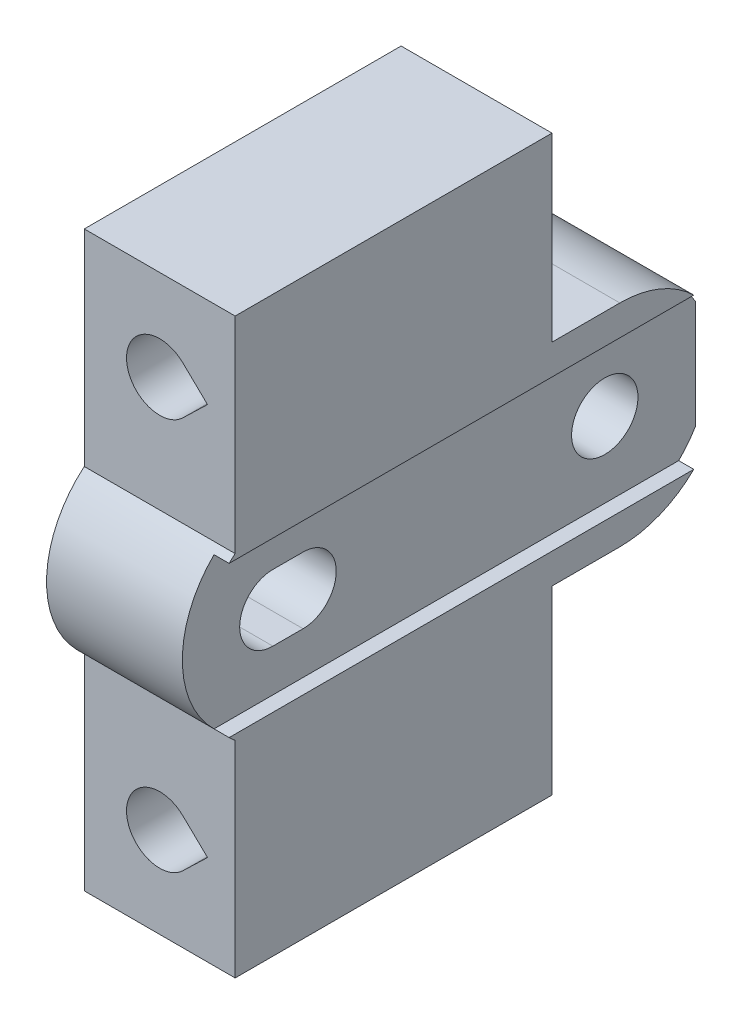
ISO-10303-21;
HEADER;
FILE_DESCRIPTION(('STEP AP214'),'2;1');
FILE_NAME('part.step','',(''),(''),'','','');
FILE_SCHEMA(('AUTOMOTIVE_DESIGN { 1 0 10303 214 1 1 1 1 }'));
ENDSEC;
DATA;
#1=APPLICATION_CONTEXT('core data for automotive mechanical design processes');
#2=APPLICATION_PROTOCOL_DEFINITION('international standard','automotive_design',2000,#1);
#3=PRODUCT_CONTEXT('',#1,'mechanical');
#4=PRODUCT('Part','Part','',(#3));
#5=PRODUCT_RELATED_PRODUCT_CATEGORY('part','',(#4));
#6=PRODUCT_DEFINITION_FORMATION('','',#4);
#7=PRODUCT_DEFINITION_CONTEXT('part definition',#1,'design');
#8=PRODUCT_DEFINITION('design','',#6,#7);
#9=PRODUCT_DEFINITION_SHAPE('','',#8);
#10=(LENGTH_UNIT() NAMED_UNIT(*) SI_UNIT(.MILLI.,.METRE.));
#11=(NAMED_UNIT(*) PLANE_ANGLE_UNIT() SI_UNIT($,.RADIAN.));
#12=(NAMED_UNIT(*) SI_UNIT($,.STERADIAN.) SOLID_ANGLE_UNIT());
#13=UNCERTAINTY_MEASURE_WITH_UNIT(LENGTH_MEASURE(1.E-05),#10,'distance_accuracy_value','');
#14=(GEOMETRIC_REPRESENTATION_CONTEXT(3) GLOBAL_UNCERTAINTY_ASSIGNED_CONTEXT((#13)) GLOBAL_UNIT_ASSIGNED_CONTEXT((#10,
#11,#12)) REPRESENTATION_CONTEXT('',''));
#15=CARTESIAN_POINT('',(0.,0.,0.));
#16=DIRECTION('',(0.,0.,1.));
#17=DIRECTION('',(1.,0.,0.));
#18=AXIS2_PLACEMENT_3D('',#15,#16,#17);
#19=CARTESIAN_POINT('',(13.9,6.99999999999998,14.9999999999964));
#20=DIRECTION('',(0.,1.,0.));
#21=DIRECTION('',(-1.,0.,0.));
#22=AXIS2_PLACEMENT_3D('',#19,#20,#21);
#23=PLANE('',#22);
#24=DIRECTION('',(0.,0.,-1.));
#25=VECTOR('',#24,1.);
#26=CARTESIAN_POINT('',(4.90000000000001,6.99999999999999,14.9999999999964));
#27=LINE('',#26,#25);
#28=CARTESIAN_POINT('',(4.90000000000001,6.99999999999999,-6.));
#29=VERTEX_POINT('',#28);
#30=CARTESIAN_POINT('',(4.90000000000001,6.99999999999999,-10.5));
#31=VERTEX_POINT('',#30);
#32=EDGE_CURVE('E392',#29,#31,#27,.T.);
#33=ORIENTED_EDGE('',*,*,#32,.F.);
#34=DIRECTION('',(-1.,0.,0.));
#35=VECTOR('',#34,1.);
#36=CARTESIAN_POINT('',(4.90000000000001,6.99999999999999,-6.));
#37=LINE('',#36,#35);
#38=CARTESIAN_POINT('',(14.9,6.99999999999998,-6.));
#39=VERTEX_POINT('',#38);
#40=EDGE_CURVE('E285',#39,#29,#37,.T.);
#41=ORIENTED_EDGE('',*,*,#40,.F.);
#42=DIRECTION('',(0.,0.,1.));
#43=VECTOR('',#42,1.);
#44=CARTESIAN_POINT('',(14.9,6.99999999999999,14.9999999999964));
#45=LINE('',#44,#43);
#46=CARTESIAN_POINT('',(14.9,6.99999999999999,-10.5));
#47=VERTEX_POINT('',#46);
#48=EDGE_CURVE('E331',#47,#39,#45,.T.);
#49=ORIENTED_EDGE('',*,*,#48,.F.);
#50=DIRECTION('',(-1.,0.,0.));
#51=VECTOR('',#50,1.);
#52=CARTESIAN_POINT('',(13.9,6.99999999999998,-10.5));
#53=LINE('',#52,#51);
#54=EDGE_CURVE('E401',#47,#31,#53,.T.);
#55=ORIENTED_EDGE('',*,*,#54,.T.);
#56=EDGE_LOOP('',(#33,#41,#49,#55));
#57=FACE_BOUND('',#56,.T.);
#58=ADVANCED_FACE('F30',(#57),#23,.T.);
#59=CARTESIAN_POINT('',(13.9,-6.99999999999999,-10.5));
#60=DIRECTION('',(0.,-1.,0.));
#61=DIRECTION('',(1.,0.,0.));
#62=AXIS2_PLACEMENT_3D('',#59,#60,#61);
#63=PLANE('',#62);
#64=DIRECTION('',(0.,0.,-1.));
#65=VECTOR('',#64,1.);
#66=CARTESIAN_POINT('',(14.9,-6.99999999999999,-10.5));
#67=LINE('',#66,#65);
#68=CARTESIAN_POINT('',(14.9,-6.99999999999999,-5.99999999999999));
#69=VERTEX_POINT('',#68);
#70=CARTESIAN_POINT('',(14.9,-6.99999999999999,-10.5));
#71=VERTEX_POINT('',#70);
#72=EDGE_CURVE('E341',#69,#71,#67,.T.);
#73=ORIENTED_EDGE('',*,*,#72,.F.);
#74=DIRECTION('',(1.,0.,0.));
#75=VECTOR('',#74,1.);
#76=CARTESIAN_POINT('',(14.9,-6.99999999999999,-6.));
#77=LINE('',#76,#75);
#78=CARTESIAN_POINT('',(4.90000000000001,-6.99999999999999,-6.));
#79=VERTEX_POINT('',#78);
#80=EDGE_CURVE('E303',#79,#69,#77,.T.);
#81=ORIENTED_EDGE('',*,*,#80,.F.);
#82=DIRECTION('',(0.,0.,1.));
#83=VECTOR('',#82,1.);
#84=CARTESIAN_POINT('',(4.90000000000001,-6.99999999999999,-10.5));
#85=LINE('',#84,#83);
#86=CARTESIAN_POINT('',(4.90000000000001,-6.99999999999999,-10.5));
#87=VERTEX_POINT('',#86);
#88=EDGE_CURVE('E373',#87,#79,#85,.T.);
#89=ORIENTED_EDGE('',*,*,#88,.F.);
#90=DIRECTION('',(-1.,0.,0.));
#91=VECTOR('',#90,1.);
#92=CARTESIAN_POINT('',(13.9,-6.99999999999999,-10.5));
#93=LINE('',#92,#91);
#94=EDGE_CURVE('E408',#71,#87,#93,.T.);
#95=ORIENTED_EDGE('',*,*,#94,.F.);
#96=EDGE_LOOP('',(#73,#81,#89,#95));
#97=FACE_BOUND('',#96,.T.);
#98=ADVANCED_FACE('F451',(#97),#63,.T.);
#99=CARTESIAN_POINT('',(13.9,0.,-10.5));
#100=DIRECTION('',(-1.,0.,0.));
#101=DIRECTION('',(0.,-1.,0.));
#102=AXIS2_PLACEMENT_3D('',#99,#100,#101);
#103=PLANE('',#102);
#104=CARTESIAN_POINT('',(13.9,0.,-10.5));
#105=DIRECTION('',(1.,0.,0.));
#106=DIRECTION('',(0.,0.,-1.));
#107=AXIS2_PLACEMENT_3D('',#104,#105,#106);
#108=CIRCLE('',#107,2.20000000000001);
#109=CARTESIAN_POINT('',(13.9,0.,-12.7));
#110=VERTEX_POINT('',#109);
#111=EDGE_CURVE('E717',#110,#110,#108,.T.);
#112=ORIENTED_EDGE('',*,*,#111,.F.);
#113=EDGE_LOOP('',(#112));
#114=FACE_BOUND('',#113,.T.);
#115=DIRECTION('',(0.,0.,-1.));
#116=VECTOR('',#115,1.);
#117=CARTESIAN_POINT('',(13.9,2.20000000000001,-10.5));
#118=LINE('',#117,#116);
#119=CARTESIAN_POINT('',(13.9,2.20000000000001,11.5));
#120=VERTEX_POINT('',#119);
#121=CARTESIAN_POINT('',(13.9,2.20000000000001,9.5));
#122=VERTEX_POINT('',#121);
#123=EDGE_CURVE('E257',#120,#122,#118,.T.);
#124=ORIENTED_EDGE('',*,*,#123,.T.);
#125=CARTESIAN_POINT('',(13.9,0.,9.5));
#126=DIRECTION('',(-1.,0.,0.));
#127=DIRECTION('',(0.,-1.,0.));
#128=AXIS2_PLACEMENT_3D('',#125,#126,#127);
#129=CIRCLE('',#128,2.2);
#130=CARTESIAN_POINT('',(13.9,-2.19999999999999,9.5));
#131=VERTEX_POINT('',#130);
#132=EDGE_CURVE('E260',#122,#131,#129,.T.);
#133=ORIENTED_EDGE('',*,*,#132,.T.);
#134=DIRECTION('',(0.,0.,1.));
#135=VECTOR('',#134,1.);
#136=CARTESIAN_POINT('',(13.9,-2.19999999999999,-10.5));
#137=LINE('',#136,#135);
#138=CARTESIAN_POINT('',(13.9,-2.19999999999999,11.5));
#139=VERTEX_POINT('',#138);
#140=EDGE_CURVE('E245',#131,#139,#137,.T.);
#141=ORIENTED_EDGE('',*,*,#140,.T.);
#142=CARTESIAN_POINT('',(13.9,0.,11.5));
#143=DIRECTION('',(-1.,0.,0.));
#144=DIRECTION('',(0.,-1.,0.));
#145=AXIS2_PLACEMENT_3D('',#142,#143,#144);
#146=CIRCLE('',#145,2.2);
#147=EDGE_CURVE('E254',#139,#120,#146,.T.);
#148=ORIENTED_EDGE('',*,*,#147,.T.);
#149=EDGE_LOOP('',(#124,#133,#141,#148));
#150=FACE_BOUND('',#149,.T.);
#151=DIRECTION('',(0.,0.,-1.));
#152=VECTOR('',#151,1.);
#153=CARTESIAN_POINT('',(13.9,5.00001329836298,-15.3989659129446));
#154=LINE('',#153,#152);
#155=CARTESIAN_POINT('',(13.9,5.00001329836298,15.3989659129446));
#156=VERTEX_POINT('',#155);
#157=CARTESIAN_POINT('',(13.9,5.00001329836297,-15.3989659129446));
#158=VERTEX_POINT('',#157);
#159=EDGE_CURVE('E320',#156,#158,#154,.T.);
#160=ORIENTED_EDGE('',*,*,#159,.F.);
#161=CARTESIAN_POINT('',(13.9,0.,10.5));
#162=DIRECTION('',(-1.,0.,0.));
#163=DIRECTION('',(0.,-1.,0.));
#164=AXIS2_PLACEMENT_3D('',#161,#162,#163);
#165=CIRCLE('',#164,6.99999999999999);
#166=CARTESIAN_POINT('',(13.9,-4.99998670163702,15.3989930581144));
#167=VERTEX_POINT('',#166);
#168=EDGE_CURVE('E361',#167,#156,#165,.T.);
#169=ORIENTED_EDGE('',*,*,#168,.F.);
#170=DIRECTION('',(0.,0.,1.));
#171=VECTOR('',#170,1.);
#172=CARTESIAN_POINT('',(13.9,-4.99998670163702,15.3989930581144));
#173=LINE('',#172,#171);
#174=CARTESIAN_POINT('',(13.9,-4.99998670163702,-15.3989930581144));
#175=VERTEX_POINT('',#174);
#176=EDGE_CURVE('E340',#175,#167,#173,.T.);
#177=ORIENTED_EDGE('',*,*,#176,.F.);
#178=CARTESIAN_POINT('',(13.9,0.,-10.5));
#179=DIRECTION('',(-1.,0.,0.));
#180=DIRECTION('',(0.,-1.,0.));
#181=AXIS2_PLACEMENT_3D('',#178,#179,#180);
#182=CIRCLE('',#181,6.99999999999999);
#183=CARTESIAN_POINT('',(13.9,-3.60555127546401,-16.5));
#184=VERTEX_POINT('',#183);
#185=EDGE_CURVE('E398',#184,#175,#182,.T.);
#186=ORIENTED_EDGE('',*,*,#185,.F.);
#187=DIRECTION('',(0.,-1.,0.));
#188=VECTOR('',#187,1.);
#189=CARTESIAN_POINT('',(13.9,3.60555127546398,-16.5));
#190=LINE('',#189,#188);
#191=CARTESIAN_POINT('',(13.9,3.60555127546398,-16.5));
#192=VERTEX_POINT('',#191);
#193=EDGE_CURVE('E382',#192,#184,#190,.T.);
#194=ORIENTED_EDGE('',*,*,#193,.F.);
#195=CARTESIAN_POINT('',(13.9,0.,-10.5));
#196=DIRECTION('',(-1.,0.,0.));
#197=DIRECTION('',(0.,-1.,0.));
#198=AXIS2_PLACEMENT_3D('',#195,#196,#197);
#199=CIRCLE('',#198,7.);
#200=EDGE_CURVE('E413',#158,#192,#199,.T.);
#201=ORIENTED_EDGE('',*,*,#200,.F.);
#202=EDGE_LOOP('',(#160,#169,#177,#186,#194,#201));
#203=FACE_BOUND('',#202,.T.);
#204=ADVANCED_FACE('F427',(#114,#150,#203),#103,.F.);
#205=CARTESIAN_POINT('',(13.9,0.,-10.5));
#206=DIRECTION('',(-1.,0.,0.));
#207=DIRECTION('',(0.,-1.,0.));
#208=AXIS2_PLACEMENT_3D('',#205,#206,#207);
#209=CYLINDRICAL_SURFACE('',#208,6.99999999999999);
#210=CARTESIAN_POINT('',(4.90000000000001,0.,-10.5));
#211=DIRECTION('',(-1.,0.,0.));
#212=DIRECTION('',(0.,-1.,0.));
#213=AXIS2_PLACEMENT_3D('',#210,#211,#212);
#214=CIRCLE('',#213,6.99999999999999);
#215=CARTESIAN_POINT('',(4.90000000000001,-3.60555127546401,-16.5));
#216=VERTEX_POINT('',#215);
#217=EDGE_CURVE('E368',#216,#87,#214,.T.);
#218=ORIENTED_EDGE('',*,*,#217,.F.);
#219=DIRECTION('',(-1.,0.,0.));
#220=VECTOR('',#219,1.);
#221=CARTESIAN_POINT('',(13.9,-3.60555127546401,-16.5));
#222=LINE('',#221,#220);
#223=EDGE_CURVE('E11',#184,#216,#222,.T.);
#224=ORIENTED_EDGE('',*,*,#223,.F.);
#225=ORIENTED_EDGE('',*,*,#185,.T.);
#226=DIRECTION('',(-1.,0.,0.));
#227=VECTOR('',#226,1.);
#228=CARTESIAN_POINT('',(14.9,-4.99998670163702,-15.3989930581144));
#229=LINE('',#228,#227);
#230=CARTESIAN_POINT('',(14.9,-4.99998670163702,-15.3989930581144));
#231=VERTEX_POINT('',#230);
#232=EDGE_CURVE('E365',#231,#175,#229,.T.);
#233=ORIENTED_EDGE('',*,*,#232,.F.);
#234=CARTESIAN_POINT('',(14.9,0.,-10.5));
#235=DIRECTION('',(1.,0.,0.));
#236=DIRECTION('',(0.,-1.,0.));
#237=AXIS2_PLACEMENT_3D('',#234,#235,#236);
#238=CIRCLE('',#237,7.);
#239=EDGE_CURVE('E343',#71,#231,#238,.T.);
#240=ORIENTED_EDGE('',*,*,#239,.F.);
#241=ORIENTED_EDGE('',*,*,#94,.T.);
#242=EDGE_LOOP('',(#218,#224,#225,#233,#240,#241));
#243=FACE_BOUND('',#242,.T.);
#244=ADVANCED_FACE('F32',(#243),#209,.T.);
#245=CARTESIAN_POINT('',(13.9,3.60555127546398,-16.5));
#246=DIRECTION('',(0.,0.,-1.));
#247=DIRECTION('',(-1.,0.,0.));
#248=AXIS2_PLACEMENT_3D('',#245,#246,#247);
#249=PLANE('',#248);
#250=DIRECTION('',(0.,-1.,0.));
#251=VECTOR('',#250,1.);
#252=CARTESIAN_POINT('',(4.90000000000001,3.60555127546398,-16.5));
#253=LINE('',#252,#251);
#254=CARTESIAN_POINT('',(4.90000000000001,3.60555127546398,-16.5));
#255=VERTEX_POINT('',#254);
#256=EDGE_CURVE('E397',#255,#216,#253,.T.);
#257=ORIENTED_EDGE('',*,*,#256,.F.);
#258=DIRECTION('',(-1.,0.,0.));
#259=VECTOR('',#258,1.);
#260=CARTESIAN_POINT('',(13.9,3.60555127546398,-16.5));
#261=LINE('',#260,#259);
#262=EDGE_CURVE('E39',#192,#255,#261,.T.);
#263=ORIENTED_EDGE('',*,*,#262,.F.);
#264=ORIENTED_EDGE('',*,*,#193,.T.);
#265=ORIENTED_EDGE('',*,*,#223,.T.);
#266=EDGE_LOOP('',(#257,#263,#264,#265));
#267=FACE_BOUND('',#266,.T.);
#268=ADVANCED_FACE('F424',(#267),#249,.T.);
#269=CARTESIAN_POINT('',(13.9,0.,-10.5));
#270=DIRECTION('',(-1.,0.,0.));
#271=DIRECTION('',(0.,-1.,0.));
#272=AXIS2_PLACEMENT_3D('',#269,#270,#271);
#273=CYLINDRICAL_SURFACE('',#272,7.);
#274=CARTESIAN_POINT('',(4.90000000000001,0.,-10.5));
#275=DIRECTION('',(-1.,0.,0.));
#276=DIRECTION('',(0.,-1.,0.));
#277=AXIS2_PLACEMENT_3D('',#274,#275,#276);
#278=CIRCLE('',#277,7.);
#279=EDGE_CURVE('E394',#31,#255,#278,.T.);
#280=ORIENTED_EDGE('',*,*,#279,.F.);
#281=ORIENTED_EDGE('',*,*,#54,.F.);
#282=CARTESIAN_POINT('',(14.9,0.,-10.5));
#283=DIRECTION('',(1.,0.,0.));
#284=DIRECTION('',(0.,-1.,0.));
#285=AXIS2_PLACEMENT_3D('',#282,#283,#284);
#286=CIRCLE('',#285,6.99999999999999);
#287=CARTESIAN_POINT('',(14.9,5.00001329836297,-15.3989659129446));
#288=VERTEX_POINT('',#287);
#289=EDGE_CURVE('E328',#288,#47,#286,.T.);
#290=ORIENTED_EDGE('',*,*,#289,.F.);
#291=DIRECTION('',(-1.,0.,0.));
#292=VECTOR('',#291,1.);
#293=CARTESIAN_POINT('',(14.9,5.00001329836297,-15.3989659129446));
#294=LINE('',#293,#292);
#295=EDGE_CURVE('E334',#288,#158,#294,.T.);
#296=ORIENTED_EDGE('',*,*,#295,.T.);
#297=ORIENTED_EDGE('',*,*,#200,.T.);
#298=ORIENTED_EDGE('',*,*,#262,.T.);
#299=EDGE_LOOP('',(#280,#281,#290,#296,#297,#298));
#300=FACE_BOUND('',#299,.T.);
#301=ADVANCED_FACE('F458',(#300),#273,.T.);
#302=CARTESIAN_POINT('',(13.9,5.36190264738483,14.9999999999964));
#303=DIRECTION('',(0.,0.,1.));
#304=DIRECTION('',(1.,0.,0.));
#305=AXIS2_PLACEMENT_3D('',#302,#303,#304);
#306=PLANE('',#305);
#307=CARTESIAN_POINT('',(9.90000000000001,13.,14.9999999999964));
#308=DIRECTION('',(0.,0.,1.));
#309=DIRECTION('',(1.,0.,0.));
#310=AXIS2_PLACEMENT_3D('',#307,#308,#309);
#311=CIRCLE('',#310,2.2);
#312=CARTESIAN_POINT('',(11.4282484150098,14.582547560745,14.9999999999964));
#313=VERTEX_POINT('',#312);
#314=CARTESIAN_POINT('',(11.4282484150098,11.417452439255,14.9999999999964));
#315=VERTEX_POINT('',#314);
#316=EDGE_CURVE('E283',#313,#315,#311,.T.);
#317=ORIENTED_EDGE('',*,*,#316,.F.);
#318=DIRECTION('',(-0.719339800338651,0.694658370458998,0.));
#319=VECTOR('',#318,1.);
#320=CARTESIAN_POINT('',(17.314769623456,8.89800010708474,14.9999999999964));
#321=LINE('',#320,#319);
#322=CARTESIAN_POINT('',(13.0670243871766,13.,14.9999999999964));
#323=VERTEX_POINT('',#322);
#324=EDGE_CURVE('E274',#323,#313,#321,.T.);
#325=ORIENTED_EDGE('',*,*,#324,.F.);
#326=DIRECTION('',(0.719339800338651,0.694658370458997,0.));
#327=VECTOR('',#326,1.);
#328=CARTESIAN_POINT('',(9.68132519337359,9.73046829367106,14.9999999999964));
#329=LINE('',#328,#327);
#330=EDGE_CURVE('E280',#315,#323,#329,.T.);
#331=ORIENTED_EDGE('',*,*,#330,.F.);
#332=EDGE_LOOP('',(#317,#325,#331));
#333=FACE_BOUND('',#332,.T.);
#334=DIRECTION('',(0.,1.,0.));
#335=VECTOR('',#334,1.);
#336=CARTESIAN_POINT('',(4.90000000000001,5.36190264738483,14.9999999999964));
#337=LINE('',#336,#335);
#338=CARTESIAN_POINT('',(4.90000000000001,5.36190264738484,14.9999999999964));
#339=VERTEX_POINT('',#338);
#340=CARTESIAN_POINT('',(4.90000000000002,19.,14.9999999999964));
#341=VERTEX_POINT('',#340);
#342=EDGE_CURVE('E390',#339,#341,#337,.T.);
#343=ORIENTED_EDGE('',*,*,#342,.F.);
#344=DIRECTION('',(-1.,0.,0.));
#345=VECTOR('',#344,1.);
#346=CARTESIAN_POINT('',(13.9,5.36190264738484,14.9999999999964));
#347=LINE('',#346,#345);
#348=CARTESIAN_POINT('',(14.9,5.36190264738484,14.9999999999964));
#349=VERTEX_POINT('',#348);
#350=EDGE_CURVE('E404',#349,#339,#347,.T.);
#351=ORIENTED_EDGE('',*,*,#350,.F.);
#352=DIRECTION('',(0.,-1.,0.));
#353=VECTOR('',#352,1.);
#354=CARTESIAN_POINT('',(14.9,5.36190264738485,14.9999999999964));
#355=LINE('',#354,#353);
#356=CARTESIAN_POINT('',(14.9,19.,14.9999999999964));
#357=VERTEX_POINT('',#356);
#358=EDGE_CURVE('E321',#357,#349,#355,.T.);
#359=ORIENTED_EDGE('',*,*,#358,.F.);
#360=DIRECTION('',(1.,0.,0.));
#361=VECTOR('',#360,1.);
#362=CARTESIAN_POINT('',(14.9,19.,14.9999999999964));
#363=LINE('',#362,#361);
#364=EDGE_CURVE('E292',#341,#357,#363,.T.);
#365=ORIENTED_EDGE('',*,*,#364,.F.);
#366=EDGE_LOOP('',(#343,#351,#359,#365));
#367=FACE_BOUND('',#366,.T.);
#368=ADVANCED_FACE('F471',(#333,#367),#306,.T.);
#369=CARTESIAN_POINT('',(13.9,0.,10.5));
#370=DIRECTION('',(-1.,0.,0.));
#371=DIRECTION('',(0.,-1.,0.));
#372=AXIS2_PLACEMENT_3D('',#369,#370,#371);
#373=CYLINDRICAL_SURFACE('',#372,6.99999999999999);
#374=CARTESIAN_POINT('',(4.90000000000001,0.,10.5));
#375=DIRECTION('',(-1.,0.,0.));
#376=DIRECTION('',(0.,-1.,0.));
#377=AXIS2_PLACEMENT_3D('',#374,#375,#376);
#378=CIRCLE('',#377,6.99999999999999);
#379=CARTESIAN_POINT('',(4.90000000000001,-5.36190264738484,14.9999999999964));
#380=VERTEX_POINT('',#379);
#381=EDGE_CURVE('E387',#380,#339,#378,.T.);
#382=ORIENTED_EDGE('',*,*,#381,.F.);
#383=DIRECTION('',(-1.,0.,0.));
#384=VECTOR('',#383,1.);
#385=CARTESIAN_POINT('',(13.9,-5.36190264738484,14.9999999999964));
#386=LINE('',#385,#384);
#387=CARTESIAN_POINT('',(14.9,-5.36190264738484,14.9999999999964));
#388=VERTEX_POINT('',#387);
#389=EDGE_CURVE('E406',#388,#380,#386,.T.);
#390=ORIENTED_EDGE('',*,*,#389,.F.);
#391=CARTESIAN_POINT('',(14.9,0.,10.5));
#392=DIRECTION('',(1.,0.,0.));
#393=DIRECTION('',(0.,-1.,0.));
#394=AXIS2_PLACEMENT_3D('',#391,#392,#393);
#395=CIRCLE('',#394,7.00000000000001);
#396=CARTESIAN_POINT('',(14.9,-4.99998670163702,15.3989930581144));
#397=VERTEX_POINT('',#396);
#398=EDGE_CURVE('E347',#397,#388,#395,.T.);
#399=ORIENTED_EDGE('',*,*,#398,.F.);
#400=DIRECTION('',(-1.,0.,0.));
#401=VECTOR('',#400,1.);
#402=CARTESIAN_POINT('',(14.9,-4.99998670163702,15.3989930581144));
#403=LINE('',#402,#401);
#404=EDGE_CURVE('E352',#397,#167,#403,.T.);
#405=ORIENTED_EDGE('',*,*,#404,.T.);
#406=ORIENTED_EDGE('',*,*,#168,.T.);
#407=DIRECTION('',(-1.,0.,0.));
#408=VECTOR('',#407,1.);
#409=CARTESIAN_POINT('',(14.9,5.00001329836298,15.3989659129446));
#410=LINE('',#409,#408);
#411=CARTESIAN_POINT('',(14.9,5.00001329836298,15.3989659129446));
#412=VERTEX_POINT('',#411);
#413=EDGE_CURVE('E338',#412,#156,#410,.T.);
#414=ORIENTED_EDGE('',*,*,#413,.F.);
#415=CARTESIAN_POINT('',(14.9,0.,10.5));
#416=DIRECTION('',(1.,0.,0.));
#417=DIRECTION('',(0.,-1.,0.));
#418=AXIS2_PLACEMENT_3D('',#415,#416,#417);
#419=CIRCLE('',#418,6.99999999999999);
#420=EDGE_CURVE('E324',#349,#412,#419,.T.);
#421=ORIENTED_EDGE('',*,*,#420,.F.);
#422=ORIENTED_EDGE('',*,*,#350,.T.);
#423=EDGE_LOOP('',(#382,#390,#399,#405,#406,#414,#421,#422));
#424=FACE_BOUND('',#423,.T.);
#425=ADVANCED_FACE('F432',(#424),#373,.T.);
#426=CARTESIAN_POINT('',(13.9,-6.99999999999999,14.9999999999964));
#427=DIRECTION('',(0.,0.,1.));
#428=DIRECTION('',(0.,-1.,0.));
#429=AXIS2_PLACEMENT_3D('',#426,#427,#428);
#430=PLANE('',#429);
#431=CARTESIAN_POINT('',(9.90000000000001,-13.,14.9999999999964));
#432=DIRECTION('',(0.,0.,1.));
#433=DIRECTION('',(0.,-1.,0.));
#434=AXIS2_PLACEMENT_3D('',#431,#432,#433);
#435=CIRCLE('',#434,2.2);
#436=CARTESIAN_POINT('',(11.4282484150098,-11.417452439255,14.9999999999964));
#437=VERTEX_POINT('',#436);
#438=CARTESIAN_POINT('',(11.4282484150098,-14.582547560745,14.9999999999964));
#439=VERTEX_POINT('',#438);
#440=EDGE_CURVE('E229',#437,#439,#435,.T.);
#441=ORIENTED_EDGE('',*,*,#440,.F.);
#442=DIRECTION('',(-0.719339800338651,0.694658370458998,0.));
#443=VECTOR('',#442,1.);
#444=CARTESIAN_POINT('',(10.4998749273575,-10.5209325834006,14.9999999999964));
#445=LINE('',#444,#443);
#446=CARTESIAN_POINT('',(13.0670243871766,-13.,14.9999999999964));
#447=VERTEX_POINT('',#446);
#448=EDGE_CURVE('E225',#447,#437,#445,.T.);
#449=ORIENTED_EDGE('',*,*,#448,.F.);
#450=DIRECTION('',(0.719339800338651,0.694658370458997,0.));
#451=VECTOR('',#450,1.);
#452=CARTESIAN_POINT('',(16.4962198894721,-9.68846439681434,14.9999999999964));
#453=LINE('',#452,#451);
#454=EDGE_CURVE('E209',#439,#447,#453,.T.);
#455=ORIENTED_EDGE('',*,*,#454,.F.);
#456=EDGE_LOOP('',(#441,#449,#455));
#457=FACE_BOUND('',#456,.T.);
#458=DIRECTION('',(0.,1.,0.));
#459=VECTOR('',#458,1.);
#460=CARTESIAN_POINT('',(4.90000000000001,-6.99999999999999,14.9999999999964));
#461=LINE('',#460,#459);
#462=CARTESIAN_POINT('',(4.90000000000001,-19.,14.9999999999964));
#463=VERTEX_POINT('',#462);
#464=EDGE_CURVE('E379',#463,#380,#461,.T.);
#465=ORIENTED_EDGE('',*,*,#464,.F.);
#466=DIRECTION('',(-1.,0.,0.));
#467=VECTOR('',#466,1.);
#468=CARTESIAN_POINT('',(4.90000000000001,-19.,14.9999999999964));
#469=LINE('',#468,#467);
#470=CARTESIAN_POINT('',(14.9,-19.,14.9999999999964));
#471=VERTEX_POINT('',#470);
#472=EDGE_CURVE('E304',#471,#463,#469,.T.);
#473=ORIENTED_EDGE('',*,*,#472,.F.);
#474=DIRECTION('',(0.,-1.,0.));
#475=VECTOR('',#474,1.);
#476=CARTESIAN_POINT('',(14.9,-6.99999999999999,14.9999999999964));
#477=LINE('',#476,#475);
#478=EDGE_CURVE('E350',#388,#471,#477,.T.);
#479=ORIENTED_EDGE('',*,*,#478,.F.);
#480=ORIENTED_EDGE('',*,*,#389,.T.);
#481=EDGE_LOOP('',(#465,#473,#479,#480));
#482=FACE_BOUND('',#481,.T.);
#483=ADVANCED_FACE('F439',(#457,#482),#430,.T.);
#484=CARTESIAN_POINT('',(4.90000000000001,0.,-10.5));
#485=DIRECTION('',(-1.,0.,0.));
#486=DIRECTION('',(0.,-1.,0.));
#487=AXIS2_PLACEMENT_3D('',#484,#485,#486);
#488=PLANE('',#487);
#489=CARTESIAN_POINT('',(4.9,0.,-10.5));
#490=DIRECTION('',(1.,0.,0.));
#491=DIRECTION('',(0.,0.,-1.));
#492=AXIS2_PLACEMENT_3D('',#489,#490,#491);
#493=CIRCLE('',#492,2.20000000000001);
#494=CARTESIAN_POINT('',(4.9,0.,-12.7));
#495=VERTEX_POINT('',#494);
#496=EDGE_CURVE('E714',#495,#495,#493,.T.);
#497=ORIENTED_EDGE('',*,*,#496,.T.);
#498=EDGE_LOOP('',(#497));
#499=FACE_BOUND('',#498,.T.);
#500=CARTESIAN_POINT('',(4.90000000000001,0.,9.5));
#501=DIRECTION('',(-1.,0.,0.));
#502=DIRECTION('',(0.,-1.,0.));
#503=AXIS2_PLACEMENT_3D('',#500,#501,#502);
#504=CIRCLE('',#503,2.2);
#505=CARTESIAN_POINT('',(4.90000000000001,2.20000000000001,9.5));
#506=VERTEX_POINT('',#505);
#507=CARTESIAN_POINT('',(4.90000000000001,-2.19999999999999,9.5));
#508=VERTEX_POINT('',#507);
#509=EDGE_CURVE('E231',#506,#508,#504,.T.);
#510=ORIENTED_EDGE('',*,*,#509,.F.);
#511=DIRECTION('',(0.,0.,-1.));
#512=VECTOR('',#511,1.);
#513=CARTESIAN_POINT('',(4.90000000000001,2.20000000000001,11.5));
#514=LINE('',#513,#512);
#515=CARTESIAN_POINT('',(4.90000000000001,2.20000000000001,11.5));
#516=VERTEX_POINT('',#515);
#517=EDGE_CURVE('E239',#516,#506,#514,.T.);
#518=ORIENTED_EDGE('',*,*,#517,.F.);
#519=CARTESIAN_POINT('',(4.90000000000001,0.,11.5));
#520=DIRECTION('',(-1.,0.,0.));
#521=DIRECTION('',(0.,-1.,0.));
#522=AXIS2_PLACEMENT_3D('',#519,#520,#521);
#523=CIRCLE('',#522,2.2);
#524=CARTESIAN_POINT('',(4.90000000000001,-2.19999999999999,11.5));
#525=VERTEX_POINT('',#524);
#526=EDGE_CURVE('E236',#525,#516,#523,.T.);
#527=ORIENTED_EDGE('',*,*,#526,.F.);
#528=DIRECTION('',(0.,0.,1.));
#529=VECTOR('',#528,1.);
#530=CARTESIAN_POINT('',(4.90000000000001,-2.19999999999999,9.5));
#531=LINE('',#530,#529);
#532=EDGE_CURVE('E233',#508,#525,#531,.T.);
#533=ORIENTED_EDGE('',*,*,#532,.F.);
#534=EDGE_LOOP('',(#510,#518,#527,#533));
#535=FACE_BOUND('',#534,.T.);
#536=ORIENTED_EDGE('',*,*,#217,.T.);
#537=ORIENTED_EDGE('',*,*,#88,.T.);
#538=DIRECTION('',(0.,1.,0.));
#539=VECTOR('',#538,1.);
#540=CARTESIAN_POINT('',(4.90000000000001,-19.,-6.));
#541=LINE('',#540,#539);
#542=CARTESIAN_POINT('',(4.90000000000001,-19.,-6.));
#543=VERTEX_POINT('',#542);
#544=EDGE_CURVE('E318',#543,#79,#541,.T.);
#545=ORIENTED_EDGE('',*,*,#544,.F.);
#546=DIRECTION('',(0.,0.,-1.));
#547=VECTOR('',#546,1.);
#548=CARTESIAN_POINT('',(4.90000000000001,-19.,-6.));
#549=LINE('',#548,#547);
#550=EDGE_CURVE('E307',#463,#543,#549,.T.);
#551=ORIENTED_EDGE('',*,*,#550,.F.);
#552=ORIENTED_EDGE('',*,*,#464,.T.);
#553=ORIENTED_EDGE('',*,*,#381,.T.);
#554=ORIENTED_EDGE('',*,*,#342,.T.);
#555=DIRECTION('',(0.,0.,1.));
#556=VECTOR('',#555,1.);
#557=CARTESIAN_POINT('',(4.90000000000002,19.,14.9999999999964));
#558=LINE('',#557,#556);
#559=CARTESIAN_POINT('',(4.90000000000002,19.,-6.));
#560=VERTEX_POINT('',#559);
#561=EDGE_CURVE('E289',#560,#341,#558,.T.);
#562=ORIENTED_EDGE('',*,*,#561,.F.);
#563=DIRECTION('',(0.,-1.,0.));
#564=VECTOR('',#563,1.);
#565=CARTESIAN_POINT('',(4.90000000000002,19.,-6.));
#566=LINE('',#565,#564);
#567=EDGE_CURVE('E301',#560,#29,#566,.T.);
#568=ORIENTED_EDGE('',*,*,#567,.T.);
#569=ORIENTED_EDGE('',*,*,#32,.T.);
#570=ORIENTED_EDGE('',*,*,#279,.T.);
#571=ORIENTED_EDGE('',*,*,#256,.T.);
#572=EDGE_LOOP('',(#536,#537,#545,#551,#552,#553,#554,#562,#568,#569,#570,#571));
#573=FACE_BOUND('',#572,.T.);
#574=ADVANCED_FACE('F478',(#499,#535,#573),#488,.T.);
#575=CARTESIAN_POINT('',(14.9,-4.99998670163702,15.3989930581144));
#576=DIRECTION('',(0.,-1.,0.));
#577=DIRECTION('',(1.,0.,0.));
#578=AXIS2_PLACEMENT_3D('',#575,#576,#577);
#579=PLANE('',#578);
#580=ORIENTED_EDGE('',*,*,#176,.T.);
#581=ORIENTED_EDGE('',*,*,#404,.F.);
#582=DIRECTION('',(0.,0.,1.));
#583=VECTOR('',#582,1.);
#584=CARTESIAN_POINT('',(14.9,-4.99998670163702,15.3989930581144));
#585=LINE('',#584,#583);
#586=EDGE_CURVE('E345',#231,#397,#585,.T.);
#587=ORIENTED_EDGE('',*,*,#586,.F.);
#588=ORIENTED_EDGE('',*,*,#232,.T.);
#589=EDGE_LOOP('',(#580,#581,#587,#588));
#590=FACE_BOUND('',#589,.T.);
#591=ADVANCED_FACE('F429',(#590),#579,.F.);
#592=CARTESIAN_POINT('',(14.9,0.,10.5));
#593=DIRECTION('',(-1.,0.,0.));
#594=DIRECTION('',(0.,-1.,0.));
#595=AXIS2_PLACEMENT_3D('',#592,#593,#594);
#596=PLANE('',#595);
#597=ORIENTED_EDGE('',*,*,#478,.T.);
#598=DIRECTION('',(0.,0.,1.));
#599=VECTOR('',#598,1.);
#600=CARTESIAN_POINT('',(14.9,-19.,14.9999999999964));
#601=LINE('',#600,#599);
#602=CARTESIAN_POINT('',(14.9,-19.,-6.));
#603=VERTEX_POINT('',#602);
#604=EDGE_CURVE('E311',#603,#471,#601,.T.);
#605=ORIENTED_EDGE('',*,*,#604,.F.);
#606=DIRECTION('',(0.,1.,0.));
#607=VECTOR('',#606,1.);
#608=CARTESIAN_POINT('',(14.9,-19.,-6.));
#609=LINE('',#608,#607);
#610=EDGE_CURVE('E314',#603,#69,#609,.T.);
#611=ORIENTED_EDGE('',*,*,#610,.T.);
#612=ORIENTED_EDGE('',*,*,#72,.T.);
#613=ORIENTED_EDGE('',*,*,#239,.T.);
#614=ORIENTED_EDGE('',*,*,#586,.T.);
#615=ORIENTED_EDGE('',*,*,#398,.T.);
#616=EDGE_LOOP('',(#597,#605,#611,#612,#613,#614,#615));
#617=FACE_BOUND('',#616,.T.);
#618=ADVANCED_FACE('F435',(#617),#596,.F.);
#619=CARTESIAN_POINT('',(14.9,5.00001329836298,-15.3989659129446));
#620=DIRECTION('',(0.,1.,0.));
#621=DIRECTION('',(0.,0.,1.));
#622=AXIS2_PLACEMENT_3D('',#619,#620,#621);
#623=PLANE('',#622);
#624=ORIENTED_EDGE('',*,*,#159,.T.);
#625=ORIENTED_EDGE('',*,*,#295,.F.);
#626=DIRECTION('',(0.,0.,-1.));
#627=VECTOR('',#626,1.);
#628=CARTESIAN_POINT('',(14.9,5.00001329836298,-15.3989659129446));
#629=LINE('',#628,#627);
#630=EDGE_CURVE('E326',#412,#288,#629,.T.);
#631=ORIENTED_EDGE('',*,*,#630,.F.);
#632=ORIENTED_EDGE('',*,*,#413,.T.);
#633=EDGE_LOOP('',(#624,#625,#631,#632));
#634=FACE_BOUND('',#633,.T.);
#635=ADVANCED_FACE('F538',(#634),#623,.F.);
#636=CARTESIAN_POINT('',(14.9,0.,-10.5));
#637=DIRECTION('',(-1.,0.,0.));
#638=DIRECTION('',(0.,-1.,0.));
#639=AXIS2_PLACEMENT_3D('',#636,#637,#638);
#640=PLANE('',#639);
#641=ORIENTED_EDGE('',*,*,#358,.T.);
#642=ORIENTED_EDGE('',*,*,#420,.T.);
#643=ORIENTED_EDGE('',*,*,#630,.T.);
#644=ORIENTED_EDGE('',*,*,#289,.T.);
#645=ORIENTED_EDGE('',*,*,#48,.T.);
#646=DIRECTION('',(0.,-1.,0.));
#647=VECTOR('',#646,1.);
#648=CARTESIAN_POINT('',(14.9,19.,-6.));
#649=LINE('',#648,#647);
#650=CARTESIAN_POINT('',(14.9,19.,-6.));
#651=VERTEX_POINT('',#650);
#652=EDGE_CURVE('E297',#651,#39,#649,.T.);
#653=ORIENTED_EDGE('',*,*,#652,.F.);
#654=DIRECTION('',(0.,0.,-1.));
#655=VECTOR('',#654,1.);
#656=CARTESIAN_POINT('',(14.9,19.,-6.));
#657=LINE('',#656,#655);
#658=EDGE_CURVE('E295',#357,#651,#657,.T.);
#659=ORIENTED_EDGE('',*,*,#658,.F.);
#660=EDGE_LOOP('',(#641,#642,#643,#644,#645,#653,#659));
#661=FACE_BOUND('',#660,.T.);
#662=ADVANCED_FACE('F535',(#661),#640,.F.);
#663=CARTESIAN_POINT('',(14.9,-19.,-6.));
#664=DIRECTION('',(0.,0.,1.));
#665=DIRECTION('',(1.,0.,0.));
#666=AXIS2_PLACEMENT_3D('',#663,#664,#665);
#667=PLANE('',#666);
#668=DIRECTION('',(0.719339800338651,-0.694658370458998,0.));
#669=VECTOR('',#668,1.);
#670=CARTESIAN_POINT('',(11.4282484150098,-11.417452439255,-6.));
#671=LINE('',#670,#669);
#672=CARTESIAN_POINT('',(11.4282484150098,-11.417452439255,-6.));
#673=VERTEX_POINT('',#672);
#674=CARTESIAN_POINT('',(13.0670243871766,-13.,-6.));
#675=VERTEX_POINT('',#674);
#676=EDGE_CURVE('E215',#673,#675,#671,.T.);
#677=ORIENTED_EDGE('',*,*,#676,.F.);
#678=CARTESIAN_POINT('',(9.90000000000001,-13.,-6.));
#679=DIRECTION('',(0.,0.,-1.));
#680=DIRECTION('',(-1.,0.,0.));
#681=AXIS2_PLACEMENT_3D('',#678,#679,#680);
#682=CIRCLE('',#681,2.2);
#683=CARTESIAN_POINT('',(11.4282484150098,-14.582547560745,-6.));
#684=VERTEX_POINT('',#683);
#685=EDGE_CURVE('E55',#684,#673,#682,.T.);
#686=ORIENTED_EDGE('',*,*,#685,.F.);
#687=DIRECTION('',(-0.719339800338651,-0.694658370458998,0.));
#688=VECTOR('',#687,1.);
#689=CARTESIAN_POINT('',(13.0670243871766,-13.,-6.));
#690=LINE('',#689,#688);
#691=EDGE_CURVE('E207',#675,#684,#690,.T.);
#692=ORIENTED_EDGE('',*,*,#691,.F.);
#693=EDGE_LOOP('',(#677,#686,#692));
#694=FACE_BOUND('',#693,.T.);
#695=ORIENTED_EDGE('',*,*,#80,.T.);
#696=ORIENTED_EDGE('',*,*,#610,.F.);
#697=DIRECTION('',(1.,0.,0.));
#698=VECTOR('',#697,1.);
#699=CARTESIAN_POINT('',(14.9,-19.,-6.));
#700=LINE('',#699,#698);
#701=EDGE_CURVE('E309',#543,#603,#700,.T.);
#702=ORIENTED_EDGE('',*,*,#701,.F.);
#703=ORIENTED_EDGE('',*,*,#544,.T.);
#704=EDGE_LOOP('',(#695,#696,#702,#703));
#705=FACE_BOUND('',#704,.T.);
#706=ADVANCED_FACE('F219',(#694,#705),#667,.F.);
#707=CARTESIAN_POINT('',(14.9,-19.,14.9999999999964));
#708=DIRECTION('',(0.,1.,0.));
#709=DIRECTION('',(-1.,0.,0.));
#710=AXIS2_PLACEMENT_3D('',#707,#708,#709);
#711=PLANE('',#710);
#712=ORIENTED_EDGE('',*,*,#472,.T.);
#713=ORIENTED_EDGE('',*,*,#550,.T.);
#714=ORIENTED_EDGE('',*,*,#701,.T.);
#715=ORIENTED_EDGE('',*,*,#604,.T.);
#716=EDGE_LOOP('',(#712,#713,#714,#715));
#717=FACE_BOUND('',#716,.T.);
#718=ADVANCED_FACE('F442',(#717),#711,.F.);
#719=CARTESIAN_POINT('',(4.90000000000002,19.,-6.));
#720=DIRECTION('',(0.,0.,1.));
#721=DIRECTION('',(1.,0.,0.));
#722=AXIS2_PLACEMENT_3D('',#719,#720,#721);
#723=PLANE('',#722);
#724=DIRECTION('',(0.719339800338651,-0.694658370458998,0.));
#725=VECTOR('',#724,1.);
#726=CARTESIAN_POINT('',(11.4282484150098,14.582547560745,-6.));
#727=LINE('',#726,#725);
#728=CARTESIAN_POINT('',(11.4282484150098,14.582547560745,-6.));
#729=VERTEX_POINT('',#728);
#730=CARTESIAN_POINT('',(13.0670243871766,13.,-6.));
#731=VERTEX_POINT('',#730);
#732=EDGE_CURVE('E265',#729,#731,#727,.T.);
#733=ORIENTED_EDGE('',*,*,#732,.F.);
#734=CARTESIAN_POINT('',(9.90000000000001,13.,-6.));
#735=DIRECTION('',(0.,0.,-1.));
#736=DIRECTION('',(-1.,0.,0.));
#737=AXIS2_PLACEMENT_3D('',#734,#735,#736);
#738=CIRCLE('',#737,2.2);
#739=CARTESIAN_POINT('',(11.4282484150098,11.417452439255,-6.));
#740=VERTEX_POINT('',#739);
#741=EDGE_CURVE('E263',#740,#729,#738,.T.);
#742=ORIENTED_EDGE('',*,*,#741,.F.);
#743=DIRECTION('',(-0.719339800338651,-0.694658370458998,0.));
#744=VECTOR('',#743,1.);
#745=CARTESIAN_POINT('',(13.0670243871766,13.,-6.));
#746=LINE('',#745,#744);
#747=EDGE_CURVE('E268',#731,#740,#746,.T.);
#748=ORIENTED_EDGE('',*,*,#747,.F.);
#749=EDGE_LOOP('',(#733,#742,#748));
#750=FACE_BOUND('',#749,.T.);
#751=ORIENTED_EDGE('',*,*,#40,.T.);
#752=ORIENTED_EDGE('',*,*,#567,.F.);
#753=DIRECTION('',(-1.,0.,0.));
#754=VECTOR('',#753,1.);
#755=CARTESIAN_POINT('',(4.90000000000002,19.,-6.));
#756=LINE('',#755,#754);
#757=EDGE_CURVE('E286',#651,#560,#756,.T.);
#758=ORIENTED_EDGE('',*,*,#757,.F.);
#759=ORIENTED_EDGE('',*,*,#652,.T.);
#760=EDGE_LOOP('',(#751,#752,#758,#759));
#761=FACE_BOUND('',#760,.T.);
#762=ADVANCED_FACE('F526',(#750,#761),#723,.F.);
#763=CARTESIAN_POINT('',(14.9,19.,-6.));
#764=DIRECTION('',(0.,-1.,0.));
#765=DIRECTION('',(1.,0.,0.));
#766=AXIS2_PLACEMENT_3D('',#763,#764,#765);
#767=PLANE('',#766);
#768=ORIENTED_EDGE('',*,*,#757,.T.);
#769=ORIENTED_EDGE('',*,*,#561,.T.);
#770=ORIENTED_EDGE('',*,*,#364,.T.);
#771=ORIENTED_EDGE('',*,*,#658,.T.);
#772=EDGE_LOOP('',(#768,#769,#770,#771));
#773=FACE_BOUND('',#772,.T.);
#774=ADVANCED_FACE('F522',(#773),#767,.F.);
#775=CARTESIAN_POINT('',(9.90000000000001,13.,17.500025));
#776=DIRECTION('',(0.,0.,-1.));
#777=DIRECTION('',(-1.,0.,0.));
#778=AXIS2_PLACEMENT_3D('',#775,#776,#777);
#779=CYLINDRICAL_SURFACE('',#778,2.2);
#780=ORIENTED_EDGE('',*,*,#316,.T.);
#781=DIRECTION('',(0.,0.,-1.));
#782=VECTOR('',#781,1.);
#783=CARTESIAN_POINT('',(11.4282484150098,11.417452439255,17.500025));
#784=LINE('',#783,#782);
#785=EDGE_CURVE('E272',#315,#740,#784,.T.);
#786=ORIENTED_EDGE('',*,*,#785,.T.);
#787=ORIENTED_EDGE('',*,*,#741,.T.);
#788=DIRECTION('',(0.,0.,-1.));
#789=VECTOR('',#788,1.);
#790=CARTESIAN_POINT('',(11.4282484150098,14.582547560745,17.500025));
#791=LINE('',#790,#789);
#792=EDGE_CURVE('E271',#313,#729,#791,.T.);
#793=ORIENTED_EDGE('',*,*,#792,.F.);
#794=EDGE_LOOP('',(#780,#786,#787,#793));
#795=FACE_BOUND('',#794,.T.);
#796=ADVANCED_FACE('F515',(#795),#779,.F.);
#797=CARTESIAN_POINT('',(13.0670243871766,13.,17.500025));
#798=DIRECTION('',(0.694658370458997,-0.719339800338651,0.));
#799=DIRECTION('',(0.719339800338651,0.694658370458997,0.));
#800=AXIS2_PLACEMENT_3D('',#797,#798,#799);
#801=PLANE('',#800);
#802=ORIENTED_EDGE('',*,*,#330,.T.);
#803=DIRECTION('',(0.,0.,-1.));
#804=VECTOR('',#803,1.);
#805=CARTESIAN_POINT('',(13.0670243871766,13.,17.500025));
#806=LINE('',#805,#804);
#807=EDGE_CURVE('E275',#323,#731,#806,.T.);
#808=ORIENTED_EDGE('',*,*,#807,.T.);
#809=ORIENTED_EDGE('',*,*,#747,.T.);
#810=ORIENTED_EDGE('',*,*,#785,.F.);
#811=EDGE_LOOP('',(#802,#808,#809,#810));
#812=FACE_BOUND('',#811,.T.);
#813=ADVANCED_FACE('F512',(#812),#801,.F.);
#814=CARTESIAN_POINT('',(11.4282484150098,14.582547560745,17.500025));
#815=DIRECTION('',(0.694658370458998,0.719339800338651,0.));
#816=DIRECTION('',(-0.719339800338651,0.694658370458998,0.));
#817=AXIS2_PLACEMENT_3D('',#814,#815,#816);
#818=PLANE('',#817);
#819=ORIENTED_EDGE('',*,*,#324,.T.);
#820=ORIENTED_EDGE('',*,*,#792,.T.);
#821=ORIENTED_EDGE('',*,*,#732,.T.);
#822=ORIENTED_EDGE('',*,*,#807,.F.);
#823=EDGE_LOOP('',(#819,#820,#821,#822));
#824=FACE_BOUND('',#823,.T.);
#825=ADVANCED_FACE('F510',(#824),#818,.F.);
#826=CARTESIAN_POINT('',(14.900025,0.,9.5));
#827=DIRECTION('',(-1.,0.,0.));
#828=DIRECTION('',(0.,-1.,0.));
#829=AXIS2_PLACEMENT_3D('',#826,#827,#828);
#830=CYLINDRICAL_SURFACE('',#829,2.2);
#831=DIRECTION('',(-1.,0.,0.));
#832=VECTOR('',#831,1.);
#833=CARTESIAN_POINT('',(14.900025,2.20000000000001,9.5));
#834=LINE('',#833,#832);
#835=EDGE_CURVE('E243',#122,#506,#834,.T.);
#836=ORIENTED_EDGE('',*,*,#835,.T.);
#837=ORIENTED_EDGE('',*,*,#509,.T.);
#838=DIRECTION('',(-1.,0.,0.));
#839=VECTOR('',#838,1.);
#840=CARTESIAN_POINT('',(14.900025,-2.19999999999999,9.5));
#841=LINE('',#840,#839);
#842=EDGE_CURVE('E242',#131,#508,#841,.T.);
#843=ORIENTED_EDGE('',*,*,#842,.F.);
#844=ORIENTED_EDGE('',*,*,#132,.F.);
#845=EDGE_LOOP('',(#836,#837,#843,#844));
#846=FACE_BOUND('',#845,.T.);
#847=ADVANCED_FACE('F503',(#846),#830,.F.);
#848=CARTESIAN_POINT('',(14.900025,2.20000000000001,11.5));
#849=DIRECTION('',(0.,1.,0.));
#850=DIRECTION('',(-1.,0.,0.));
#851=AXIS2_PLACEMENT_3D('',#848,#849,#850);
#852=PLANE('',#851);
#853=DIRECTION('',(-1.,0.,0.));
#854=VECTOR('',#853,1.);
#855=CARTESIAN_POINT('',(14.900025,2.20000000000001,11.5));
#856=LINE('',#855,#854);
#857=EDGE_CURVE('E246',#120,#516,#856,.T.);
#858=ORIENTED_EDGE('',*,*,#857,.T.);
#859=ORIENTED_EDGE('',*,*,#517,.T.);
#860=ORIENTED_EDGE('',*,*,#835,.F.);
#861=ORIENTED_EDGE('',*,*,#123,.F.);
#862=EDGE_LOOP('',(#858,#859,#860,#861));
#863=FACE_BOUND('',#862,.T.);
#864=ADVANCED_FACE('F500',(#863),#852,.F.);
#865=CARTESIAN_POINT('',(14.900025,0.,11.5));
#866=DIRECTION('',(-1.,0.,0.));
#867=DIRECTION('',(0.,-1.,0.));
#868=AXIS2_PLACEMENT_3D('',#865,#866,#867);
#869=CYLINDRICAL_SURFACE('',#868,2.2);
#870=DIRECTION('',(-1.,0.,0.));
#871=VECTOR('',#870,1.);
#872=CARTESIAN_POINT('',(14.900025,-2.19999999999999,11.5));
#873=LINE('',#872,#871);
#874=EDGE_CURVE('E248',#139,#525,#873,.T.);
#875=ORIENTED_EDGE('',*,*,#874,.T.);
#876=ORIENTED_EDGE('',*,*,#526,.T.);
#877=ORIENTED_EDGE('',*,*,#857,.F.);
#878=ORIENTED_EDGE('',*,*,#147,.F.);
#879=EDGE_LOOP('',(#875,#876,#877,#878));
#880=FACE_BOUND('',#879,.T.);
#881=ADVANCED_FACE('F495',(#880),#869,.F.);
#882=CARTESIAN_POINT('',(14.900025,-2.19999999999999,9.5));
#883=DIRECTION('',(0.,-1.,0.));
#884=DIRECTION('',(1.,0.,0.));
#885=AXIS2_PLACEMENT_3D('',#882,#883,#884);
#886=PLANE('',#885);
#887=ORIENTED_EDGE('',*,*,#842,.T.);
#888=ORIENTED_EDGE('',*,*,#532,.T.);
#889=ORIENTED_EDGE('',*,*,#874,.F.);
#890=ORIENTED_EDGE('',*,*,#140,.F.);
#891=EDGE_LOOP('',(#887,#888,#889,#890));
#892=FACE_BOUND('',#891,.T.);
#893=ADVANCED_FACE('F488',(#892),#886,.F.);
#894=CARTESIAN_POINT('',(9.90000000000001,-13.,17.500025));
#895=DIRECTION('',(0.,0.,-1.));
#896=DIRECTION('',(-1.,0.,0.));
#897=AXIS2_PLACEMENT_3D('',#894,#895,#896);
#898=CYLINDRICAL_SURFACE('',#897,2.2);
#899=ORIENTED_EDGE('',*,*,#440,.T.);
#900=DIRECTION('',(0.,0.,-1.));
#901=VECTOR('',#900,1.);
#902=CARTESIAN_POINT('',(11.4282484150098,-14.582547560745,17.500025));
#903=LINE('',#902,#901);
#904=EDGE_CURVE('E211',#439,#684,#903,.T.);
#905=ORIENTED_EDGE('',*,*,#904,.T.);
#906=ORIENTED_EDGE('',*,*,#685,.T.);
#907=DIRECTION('',(0.,0.,-1.));
#908=VECTOR('',#907,1.);
#909=CARTESIAN_POINT('',(11.4282484150098,-11.417452439255,17.500025));
#910=LINE('',#909,#908);
#911=EDGE_CURVE('E212',#437,#673,#910,.T.);
#912=ORIENTED_EDGE('',*,*,#911,.F.);
#913=EDGE_LOOP('',(#899,#905,#906,#912));
#914=FACE_BOUND('',#913,.T.);
#915=ADVANCED_FACE('F486',(#914),#898,.F.);
#916=CARTESIAN_POINT('',(13.0670243871766,-13.,17.500025));
#917=DIRECTION('',(0.694658370458997,-0.719339800338651,0.));
#918=DIRECTION('',(0.719339800338651,0.694658370458997,0.));
#919=AXIS2_PLACEMENT_3D('',#916,#917,#918);
#920=PLANE('',#919);
#921=ORIENTED_EDGE('',*,*,#454,.T.);
#922=DIRECTION('',(0.,0.,-1.));
#923=VECTOR('',#922,1.);
#924=CARTESIAN_POINT('',(13.0670243871766,-13.,17.500025));
#925=LINE('',#924,#923);
#926=EDGE_CURVE('E47',#447,#675,#925,.T.);
#927=ORIENTED_EDGE('',*,*,#926,.T.);
#928=ORIENTED_EDGE('',*,*,#691,.T.);
#929=ORIENTED_EDGE('',*,*,#904,.F.);
#930=EDGE_LOOP('',(#921,#927,#928,#929));
#931=FACE_BOUND('',#930,.T.);
#932=ADVANCED_FACE('F204',(#931),#920,.F.);
#933=CARTESIAN_POINT('',(11.4282484150098,-11.417452439255,17.500025));
#934=DIRECTION('',(0.694658370458998,0.719339800338651,0.));
#935=DIRECTION('',(-0.719339800338651,0.694658370458998,0.));
#936=AXIS2_PLACEMENT_3D('',#933,#934,#935);
#937=PLANE('',#936);
#938=ORIENTED_EDGE('',*,*,#448,.T.);
#939=ORIENTED_EDGE('',*,*,#911,.T.);
#940=ORIENTED_EDGE('',*,*,#676,.T.);
#941=ORIENTED_EDGE('',*,*,#926,.F.);
#942=EDGE_LOOP('',(#938,#939,#940,#941));
#943=FACE_BOUND('',#942,.T.);
#944=ADVANCED_FACE('F216',(#943),#937,.F.);
#945=CARTESIAN_POINT('',(13.9,0.,-10.5));
#946=DIRECTION('',(1.,0.,0.));
#947=DIRECTION('',(0.,0.,-1.));
#948=AXIS2_PLACEMENT_3D('',#945,#946,#947);
#949=CYLINDRICAL_SURFACE('',#948,2.20000000000001);
#950=ORIENTED_EDGE('',*,*,#496,.F.);
#951=EDGE_LOOP('',(#950));
#952=FACE_BOUND('',#951,.T.);
#953=ORIENTED_EDGE('',*,*,#111,.T.);
#954=EDGE_LOOP('',(#953));
#955=FACE_BOUND('',#954,.T.);
#956=ADVANCED_FACE('F691',(#952,#955),#949,.F.);
#957=CLOSED_SHELL('',(#58,#98,#204,#244,#268,#301,#368,#425,#483,#574,#591,#618,#635,#662,#706,
#718,#762,#774,#796,#813,#825,#847,#864,#881,#893,#915,#932,#944,#956));
#958=MANIFOLD_SOLID_BREP('B2',#957);
#959=ADVANCED_BREP_SHAPE_REPRESENTATION('',(#18,#958),#14);
#960=SHAPE_DEFINITION_REPRESENTATION(#9,#959);
ENDSEC;
END-ISO-10303-21;
